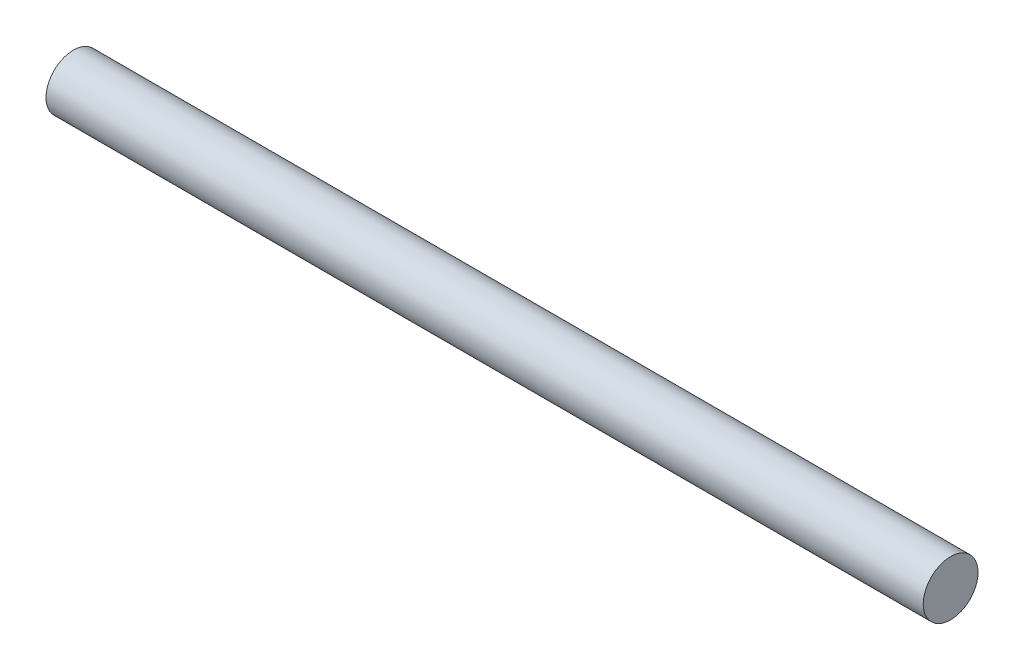
ISO-10303-21;
HEADER;
FILE_DESCRIPTION(('STEP AP214'),'2;1');
FILE_NAME('part.step','',(''),(''),'','','');
FILE_SCHEMA(('AUTOMOTIVE_DESIGN { 1 0 10303 214 1 1 1 1 }'));
ENDSEC;
DATA;
#1=APPLICATION_CONTEXT('core data for automotive mechanical design processes');
#2=APPLICATION_PROTOCOL_DEFINITION('international standard','automotive_design',2000,#1);
#3=PRODUCT_CONTEXT('',#1,'mechanical');
#4=PRODUCT('Part','Part','',(#3));
#5=PRODUCT_RELATED_PRODUCT_CATEGORY('part','',(#4));
#6=PRODUCT_DEFINITION_FORMATION('','',#4);
#7=PRODUCT_DEFINITION_CONTEXT('part definition',#1,'design');
#8=PRODUCT_DEFINITION('design','',#6,#7);
#9=PRODUCT_DEFINITION_SHAPE('','',#8);
#10=(LENGTH_UNIT() NAMED_UNIT(*) SI_UNIT(.MILLI.,.METRE.));
#11=(NAMED_UNIT(*) PLANE_ANGLE_UNIT() SI_UNIT($,.RADIAN.));
#12=(NAMED_UNIT(*) SI_UNIT($,.STERADIAN.) SOLID_ANGLE_UNIT());
#13=UNCERTAINTY_MEASURE_WITH_UNIT(LENGTH_MEASURE(1.E-05),#10,'distance_accuracy_value','');
#14=(GEOMETRIC_REPRESENTATION_CONTEXT(3) GLOBAL_UNCERTAINTY_ASSIGNED_CONTEXT((#13)) GLOBAL_UNIT_ASSIGNED_CONTEXT((#10,
#11,#12)) REPRESENTATION_CONTEXT('',''));
#15=CARTESIAN_POINT('',(0.,0.,0.));
#16=DIRECTION('',(0.,0.,1.));
#17=DIRECTION('',(1.,0.,0.));
#18=AXIS2_PLACEMENT_3D('',#15,#16,#17);
#19=CARTESIAN_POINT('',(304.8,0.,0.));
#20=DIRECTION('',(-1.,0.,0.));
#21=DIRECTION('',(0.,0.,1.));
#22=AXIS2_PLACEMENT_3D('',#19,#20,#21);
#23=CYLINDRICAL_SURFACE('',#22,19.05);
#24=CARTESIAN_POINT('',(304.8,0.,0.));
#25=DIRECTION('',(1.,0.,0.));
#26=DIRECTION('',(0.,0.,-1.));
#27=AXIS2_PLACEMENT_3D('',#24,#25,#26);
#28=CIRCLE('',#27,19.05);
#29=CARTESIAN_POINT('',(304.8,0.,19.05));
#30=VERTEX_POINT('',#29);
#31=EDGE_CURVE('E10',#30,#30,#28,.T.);
#32=CARTESIAN_POINT('',(-304.8,0.,0.));
#33=DIRECTION('',(1.,0.,0.));
#34=DIRECTION('',(0.,0.,-1.));
#35=AXIS2_PLACEMENT_3D('',#32,#33,#34);
#36=CIRCLE('',#35,19.05);
#37=CARTESIAN_POINT('',(-304.8,0.,19.05));
#38=VERTEX_POINT('',#37);
#39=EDGE_CURVE('E34',#38,#38,#36,.T.);
#40=CARTESIAN_POINT('',(304.8,0.,19.05));
#41=CARTESIAN_POINT('',(298.45,0.,19.05));
#42=CARTESIAN_POINT('',(292.1,0.,19.05));
#43=CARTESIAN_POINT('',(279.4,0.,19.05));
#44=CARTESIAN_POINT('',(273.05,0.,19.05));
#45=CARTESIAN_POINT('',(260.35,0.,19.05));
#46=CARTESIAN_POINT('',(254.,0.,19.05));
#47=CARTESIAN_POINT('',(241.3,0.,19.05));
#48=CARTESIAN_POINT('',(234.95,0.,19.05));
#49=CARTESIAN_POINT('',(222.25,0.,19.05));
#50=CARTESIAN_POINT('',(215.9,0.,19.05));
#51=CARTESIAN_POINT('',(203.2,0.,19.05));
#52=CARTESIAN_POINT('',(196.85,0.,19.05));
#53=CARTESIAN_POINT('',(184.15,0.,19.05));
#54=CARTESIAN_POINT('',(177.8,0.,19.05));
#55=CARTESIAN_POINT('',(165.1,0.,19.05));
#56=CARTESIAN_POINT('',(158.75,0.,19.05));
#57=CARTESIAN_POINT('',(146.05,0.,19.05));
#58=CARTESIAN_POINT('',(139.7,0.,19.05));
#59=CARTESIAN_POINT('',(127.,0.,19.05));
#60=CARTESIAN_POINT('',(120.65,0.,19.05));
#61=CARTESIAN_POINT('',(107.95,0.,19.05));
#62=CARTESIAN_POINT('',(101.6,0.,19.05));
#63=CARTESIAN_POINT('',(88.9,0.,19.05));
#64=CARTESIAN_POINT('',(82.55,0.,19.05));
#65=CARTESIAN_POINT('',(69.85,0.,19.05));
#66=CARTESIAN_POINT('',(63.5,0.,19.05));
#67=CARTESIAN_POINT('',(50.8,0.,19.05));
#68=CARTESIAN_POINT('',(44.45,0.,19.05));
#69=CARTESIAN_POINT('',(31.75,0.,19.05));
#70=CARTESIAN_POINT('',(25.4,0.,19.05));
#71=CARTESIAN_POINT('',(12.7,0.,19.05));
#72=CARTESIAN_POINT('',(6.34999999999995,0.,19.05));
#73=CARTESIAN_POINT('',(-6.35000000000006,0.,19.05));
#74=CARTESIAN_POINT('',(-12.7000000000001,0.,19.05));
#75=CARTESIAN_POINT('',(-25.4000000000001,0.,19.05));
#76=CARTESIAN_POINT('',(-31.7500000000001,0.,19.05));
#77=CARTESIAN_POINT('',(-44.4500000000001,0.,19.05));
#78=CARTESIAN_POINT('',(-50.8000000000001,0.,19.05));
#79=CARTESIAN_POINT('',(-63.5000000000001,0.,19.05));
#80=CARTESIAN_POINT('',(-69.8500000000001,0.,19.05));
#81=CARTESIAN_POINT('',(-82.5500000000001,0.,19.05));
#82=CARTESIAN_POINT('',(-88.9000000000001,0.,19.05));
#83=CARTESIAN_POINT('',(-101.6,0.,19.05));
#84=CARTESIAN_POINT('',(-107.95,0.,19.05));
#85=CARTESIAN_POINT('',(-120.65,0.,19.05));
#86=CARTESIAN_POINT('',(-127.,0.,19.05));
#87=CARTESIAN_POINT('',(-139.7,0.,19.05));
#88=CARTESIAN_POINT('',(-146.05,0.,19.05));
#89=CARTESIAN_POINT('',(-158.75,0.,19.05));
#90=CARTESIAN_POINT('',(-165.1,0.,19.05));
#91=CARTESIAN_POINT('',(-177.8,0.,19.05));
#92=CARTESIAN_POINT('',(-184.15,0.,19.05));
#93=CARTESIAN_POINT('',(-196.85,0.,19.05));
#94=CARTESIAN_POINT('',(-203.2,0.,19.05));
#95=CARTESIAN_POINT('',(-215.9,0.,19.05));
#96=CARTESIAN_POINT('',(-222.25,0.,19.05));
#97=CARTESIAN_POINT('',(-234.95,0.,19.05));
#98=CARTESIAN_POINT('',(-241.3,0.,19.05));
#99=CARTESIAN_POINT('',(-254.,0.,19.05));
#100=CARTESIAN_POINT('',(-260.35,0.,19.05));
#101=CARTESIAN_POINT('',(-273.05,0.,19.05));
#102=CARTESIAN_POINT('',(-279.4,0.,19.05));
#103=CARTESIAN_POINT('',(-292.1,0.,19.05));
#104=CARTESIAN_POINT('',(-298.45,0.,19.05));
#105=CARTESIAN_POINT('',(-304.8,0.,19.05));
#106=B_SPLINE_CURVE_WITH_KNOTS('',3,(#40,#41,#42,#43,#44,#45,#46,#47,#48,#49,#50,#51,#52,#53,
#54,#55,#56,#57,#58,#59,#60,#61,#62,#63,#64,#65,#66,#67,#68,#69,#70,#71,#72,#73,#74,#75,#76,#77,
#78,#79,#80,#81,#82,#83,#84,#85,#86,#87,#88,#89,#90,#91,#92,#93,#94,#95,#96,#97,#98,#99,#100,
#101,#102,#103,#104,#105),.UNSPECIFIED.,.F.,.F.,(4,2,2,2,2,2,2,2,2,2,2,2,2,2,2,2,2,2,2,2,2,2,2,
2,2,2,2,2,2,2,2,2,4),(0.,19.05,38.1,57.15,76.2,95.25,114.3,133.35,152.4,171.45,190.5,209.55,
228.6,247.65,266.7,285.75,304.8,323.85,342.9,361.95,381.,400.05,419.1,438.15,457.2,476.25,495.3,
514.35,533.4,552.45,571.5,590.55,609.6),.UNSPECIFIED.);
#107=EDGE_CURVE('BSEAM31',#30,#38,#106,.T.);
#108=ORIENTED_EDGE('',*,*,#31,.F.);
#109=ORIENTED_EDGE('',*,*,#39,.T.);
#110=ORIENTED_EDGE('',*,*,#107,.T.);
#111=ORIENTED_EDGE('',*,*,#107,.F.);
#112=EDGE_LOOP('',(#108,#110,#109,#111));
#113=FACE_BOUND('',#112,.T.);
#114=ADVANCED_FACE('F31',(#113),#23,.T.);
#115=CARTESIAN_POINT('',(304.8,0.,0.));
#116=DIRECTION('',(1.,0.,0.));
#117=DIRECTION('',(0.,0.,-1.));
#118=AXIS2_PLACEMENT_3D('',#115,#116,#117);
#119=PLANE('',#118);
#120=ORIENTED_EDGE('',*,*,#31,.T.);
#121=EDGE_LOOP('',(#120));
#122=FACE_BOUND('',#121,.T.);
#123=ADVANCED_FACE('F46',(#122),#119,.T.);
#124=CARTESIAN_POINT('',(-304.8,0.,0.));
#125=DIRECTION('',(1.,0.,0.));
#126=DIRECTION('',(0.,0.,-1.));
#127=AXIS2_PLACEMENT_3D('',#124,#125,#126);
#128=PLANE('',#127);
#129=ORIENTED_EDGE('',*,*,#39,.F.);
#130=EDGE_LOOP('',(#129));
#131=FACE_BOUND('',#130,.T.);
#132=ADVANCED_FACE('F44',(#131),#128,.F.);
#133=CLOSED_SHELL('',(#114,#123,#132));
#134=MANIFOLD_SOLID_BREP('B2',#133);
#135=ADVANCED_BREP_SHAPE_REPRESENTATION('',(#18,#134),#14);
#136=SHAPE_DEFINITION_REPRESENTATION(#9,#135);
ENDSEC;
END-ISO-10303-21;
